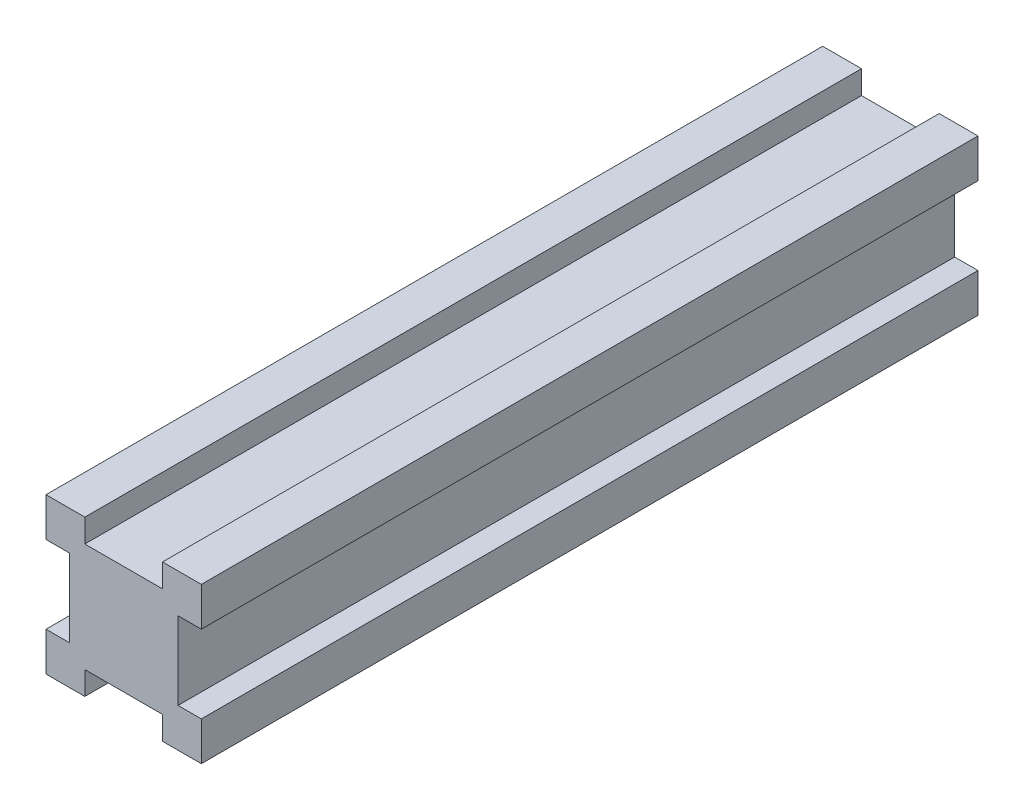
ISO-10303-21;
HEADER;
FILE_DESCRIPTION(('STEP AP214'),'2;1');
FILE_NAME('part.step','',(''),(''),'','','');
FILE_SCHEMA(('AUTOMOTIVE_DESIGN { 1 0 10303 214 1 1 1 1 }'));
ENDSEC;
DATA;
#1=APPLICATION_CONTEXT('core data for automotive mechanical design processes');
#2=APPLICATION_PROTOCOL_DEFINITION('international standard','automotive_design',2000,#1);
#3=PRODUCT_CONTEXT('',#1,'mechanical');
#4=PRODUCT('Part','Part','',(#3));
#5=PRODUCT_RELATED_PRODUCT_CATEGORY('part','',(#4));
#6=PRODUCT_DEFINITION_FORMATION('','',#4);
#7=PRODUCT_DEFINITION_CONTEXT('part definition',#1,'design');
#8=PRODUCT_DEFINITION('design','',#6,#7);
#9=PRODUCT_DEFINITION_SHAPE('','',#8);
#10=(LENGTH_UNIT() NAMED_UNIT(*) SI_UNIT(.MILLI.,.METRE.));
#11=(NAMED_UNIT(*) PLANE_ANGLE_UNIT() SI_UNIT($,.RADIAN.));
#12=(NAMED_UNIT(*) SI_UNIT($,.STERADIAN.) SOLID_ANGLE_UNIT());
#13=UNCERTAINTY_MEASURE_WITH_UNIT(LENGTH_MEASURE(1.E-05),#10,'distance_accuracy_value','');
#14=(GEOMETRIC_REPRESENTATION_CONTEXT(3) GLOBAL_UNCERTAINTY_ASSIGNED_CONTEXT((#13)) GLOBAL_UNIT_ASSIGNED_CONTEXT((#10,
#11,#12)) REPRESENTATION_CONTEXT('',''));
#15=CARTESIAN_POINT('',(0.,0.,0.));
#16=DIRECTION('',(0.,0.,1.));
#17=DIRECTION('',(1.,0.,0.));
#18=AXIS2_PLACEMENT_3D('',#15,#16,#17);
#19=CARTESIAN_POINT('',(-10.,0.,50.));
#20=DIRECTION('',(-1.,0.,0.));
#21=DIRECTION('',(0.,-1.,0.));
#22=AXIS2_PLACEMENT_3D('',#19,#20,#21);
#23=PLANE('',#22);
#24=DIRECTION('',(0.,1.,0.));
#25=VECTOR('',#24,1.);
#26=CARTESIAN_POINT('',(-10.,0.,-50.));
#27=LINE('',#26,#25);
#28=CARTESIAN_POINT('',(-10.,5.,-50.));
#29=VERTEX_POINT('',#28);
#30=CARTESIAN_POINT('',(-10.,10.,-50.));
#31=VERTEX_POINT('',#30);
#32=EDGE_CURVE('E204',#29,#31,#27,.T.);
#33=ORIENTED_EDGE('',*,*,#32,.F.);
#34=DIRECTION('',(0.,0.,-1.));
#35=VECTOR('',#34,1.);
#36=CARTESIAN_POINT('',(-10.,5.,50.));
#37=LINE('',#36,#35);
#38=CARTESIAN_POINT('',(-10.,5.,50.));
#39=VERTEX_POINT('',#38);
#40=EDGE_CURVE('E11',#39,#29,#37,.T.);
#41=ORIENTED_EDGE('',*,*,#40,.F.);
#42=DIRECTION('',(0.,1.,0.));
#43=VECTOR('',#42,1.);
#44=CARTESIAN_POINT('',(-10.,0.,50.));
#45=LINE('',#44,#43);
#46=CARTESIAN_POINT('',(-10.,10.,50.));
#47=VERTEX_POINT('',#46);
#48=EDGE_CURVE('E258',#39,#47,#45,.T.);
#49=ORIENTED_EDGE('',*,*,#48,.T.);
#50=DIRECTION('',(0.,0.,-1.));
#51=VECTOR('',#50,1.);
#52=CARTESIAN_POINT('',(-10.,10.,50.));
#53=LINE('',#52,#51);
#54=EDGE_CURVE('E55',#47,#31,#53,.T.);
#55=ORIENTED_EDGE('',*,*,#54,.T.);
#56=EDGE_LOOP('',(#33,#41,#49,#55));
#57=FACE_BOUND('',#56,.T.);
#58=ADVANCED_FACE('F39',(#57),#23,.T.);
#59=CARTESIAN_POINT('',(0.,5.,50.));
#60=DIRECTION('',(0.,-1.,0.));
#61=DIRECTION('',(1.,0.,0.));
#62=AXIS2_PLACEMENT_3D('',#59,#60,#61);
#63=PLANE('',#62);
#64=DIRECTION('',(-1.,0.,0.));
#65=VECTOR('',#64,1.);
#66=CARTESIAN_POINT('',(0.,5.,-50.));
#67=LINE('',#66,#65);
#68=CARTESIAN_POINT('',(-7.,5.,-50.));
#69=VERTEX_POINT('',#68);
#70=EDGE_CURVE('E206',#69,#29,#67,.T.);
#71=ORIENTED_EDGE('',*,*,#70,.F.);
#72=DIRECTION('',(0.,0.,-1.));
#73=VECTOR('',#72,1.);
#74=CARTESIAN_POINT('',(-7.,5.,50.));
#75=LINE('',#74,#73);
#76=CARTESIAN_POINT('',(-7.,5.,50.));
#77=VERTEX_POINT('',#76);
#78=EDGE_CURVE('E47',#77,#69,#75,.T.);
#79=ORIENTED_EDGE('',*,*,#78,.F.);
#80=DIRECTION('',(-1.,0.,0.));
#81=VECTOR('',#80,1.);
#82=CARTESIAN_POINT('',(0.,5.,50.));
#83=LINE('',#82,#81);
#84=EDGE_CURVE('E313',#77,#39,#83,.T.);
#85=ORIENTED_EDGE('',*,*,#84,.T.);
#86=ORIENTED_EDGE('',*,*,#40,.T.);
#87=EDGE_LOOP('',(#71,#79,#85,#86));
#88=FACE_BOUND('',#87,.T.);
#89=ADVANCED_FACE('F300',(#88),#63,.T.);
#90=CARTESIAN_POINT('',(-7.,0.,50.));
#91=DIRECTION('',(-1.,0.,0.));
#92=DIRECTION('',(0.,-1.,0.));
#93=AXIS2_PLACEMENT_3D('',#90,#91,#92);
#94=PLANE('',#93);
#95=DIRECTION('',(0.,1.,0.));
#96=VECTOR('',#95,1.);
#97=CARTESIAN_POINT('',(-7.,0.,-50.));
#98=LINE('',#97,#96);
#99=CARTESIAN_POINT('',(-7.,-5.,-50.));
#100=VERTEX_POINT('',#99);
#101=EDGE_CURVE('E209',#100,#69,#98,.T.);
#102=ORIENTED_EDGE('',*,*,#101,.F.);
#103=DIRECTION('',(0.,0.,-1.));
#104=VECTOR('',#103,1.);
#105=CARTESIAN_POINT('',(-7.,-5.,50.));
#106=LINE('',#105,#104);
#107=CARTESIAN_POINT('',(-7.,-5.,50.));
#108=VERTEX_POINT('',#107);
#109=EDGE_CURVE('E289',#108,#100,#106,.T.);
#110=ORIENTED_EDGE('',*,*,#109,.F.);
#111=DIRECTION('',(0.,1.,0.));
#112=VECTOR('',#111,1.);
#113=CARTESIAN_POINT('',(-7.,0.,50.));
#114=LINE('',#113,#112);
#115=EDGE_CURVE('E296',#108,#77,#114,.T.);
#116=ORIENTED_EDGE('',*,*,#115,.T.);
#117=ORIENTED_EDGE('',*,*,#78,.T.);
#118=EDGE_LOOP('',(#102,#110,#116,#117));
#119=FACE_BOUND('',#118,.T.);
#120=ADVANCED_FACE('F294',(#119),#94,.T.);
#121=CARTESIAN_POINT('',(0.,-5.,50.));
#122=DIRECTION('',(0.,1.,0.));
#123=DIRECTION('',(-1.,0.,0.));
#124=AXIS2_PLACEMENT_3D('',#121,#122,#123);
#125=PLANE('',#124);
#126=DIRECTION('',(1.,0.,0.));
#127=VECTOR('',#126,1.);
#128=CARTESIAN_POINT('',(0.,-5.,-50.));
#129=LINE('',#128,#127);
#130=CARTESIAN_POINT('',(-10.,-5.,-50.));
#131=VERTEX_POINT('',#130);
#132=EDGE_CURVE('E212',#131,#100,#129,.T.);
#133=ORIENTED_EDGE('',*,*,#132,.F.);
#134=DIRECTION('',(0.,0.,-1.));
#135=VECTOR('',#134,1.);
#136=CARTESIAN_POINT('',(-10.,-5.,50.));
#137=LINE('',#136,#135);
#138=CARTESIAN_POINT('',(-10.,-5.,50.));
#139=VERTEX_POINT('',#138);
#140=EDGE_CURVE('E287',#139,#131,#137,.T.);
#141=ORIENTED_EDGE('',*,*,#140,.F.);
#142=DIRECTION('',(1.,0.,0.));
#143=VECTOR('',#142,1.);
#144=CARTESIAN_POINT('',(0.,-5.,50.));
#145=LINE('',#144,#143);
#146=EDGE_CURVE('E310',#139,#108,#145,.T.);
#147=ORIENTED_EDGE('',*,*,#146,.T.);
#148=ORIENTED_EDGE('',*,*,#109,.T.);
#149=EDGE_LOOP('',(#133,#141,#147,#148));
#150=FACE_BOUND('',#149,.T.);
#151=ADVANCED_FACE('F307',(#150),#125,.T.);
#152=CARTESIAN_POINT('',(-9.99999999999999,0.,50.));
#153=DIRECTION('',(-1.,0.,0.));
#154=DIRECTION('',(0.,-1.,0.));
#155=AXIS2_PLACEMENT_3D('',#152,#153,#154);
#156=PLANE('',#155);
#157=DIRECTION('',(0.,1.,0.));
#158=VECTOR('',#157,1.);
#159=CARTESIAN_POINT('',(-9.99999999999999,0.,-50.));
#160=LINE('',#159,#158);
#161=CARTESIAN_POINT('',(-10.,-10.,-50.));
#162=VERTEX_POINT('',#161);
#163=EDGE_CURVE('E215',#162,#131,#160,.T.);
#164=ORIENTED_EDGE('',*,*,#163,.F.);
#165=DIRECTION('',(0.,0.,-1.));
#166=VECTOR('',#165,1.);
#167=CARTESIAN_POINT('',(-10.,-10.,50.));
#168=LINE('',#167,#166);
#169=CARTESIAN_POINT('',(-10.,-10.,50.));
#170=VERTEX_POINT('',#169);
#171=EDGE_CURVE('E285',#170,#162,#168,.T.);
#172=ORIENTED_EDGE('',*,*,#171,.F.);
#173=DIRECTION('',(0.,1.,0.));
#174=VECTOR('',#173,1.);
#175=CARTESIAN_POINT('',(-9.99999999999999,0.,50.));
#176=LINE('',#175,#174);
#177=EDGE_CURVE('E315',#170,#139,#176,.T.);
#178=ORIENTED_EDGE('',*,*,#177,.T.);
#179=ORIENTED_EDGE('',*,*,#140,.T.);
#180=EDGE_LOOP('',(#164,#172,#178,#179));
#181=FACE_BOUND('',#180,.T.);
#182=ADVANCED_FACE('F373',(#181),#156,.T.);
#183=CARTESIAN_POINT('',(0.,-10.,50.));
#184=DIRECTION('',(0.,1.,0.));
#185=DIRECTION('',(0.,0.,1.));
#186=AXIS2_PLACEMENT_3D('',#183,#184,#185);
#187=PLANE('',#186);
#188=DIRECTION('',(1.,0.,0.));
#189=VECTOR('',#188,1.);
#190=CARTESIAN_POINT('',(0.,-10.,-50.));
#191=LINE('',#190,#189);
#192=CARTESIAN_POINT('',(-5.,-10.,-50.));
#193=VERTEX_POINT('',#192);
#194=EDGE_CURVE('E218',#162,#193,#191,.T.);
#195=ORIENTED_EDGE('',*,*,#194,.T.);
#196=DIRECTION('',(0.,0.,-1.));
#197=VECTOR('',#196,1.);
#198=CARTESIAN_POINT('',(-5.,-10.,50.));
#199=LINE('',#198,#197);
#200=CARTESIAN_POINT('',(-5.,-10.,50.));
#201=VERTEX_POINT('',#200);
#202=EDGE_CURVE('E283',#201,#193,#199,.T.);
#203=ORIENTED_EDGE('',*,*,#202,.F.);
#204=DIRECTION('',(1.,0.,0.));
#205=VECTOR('',#204,1.);
#206=CARTESIAN_POINT('',(0.,-10.,50.));
#207=LINE('',#206,#205);
#208=EDGE_CURVE('E321',#170,#201,#207,.T.);
#209=ORIENTED_EDGE('',*,*,#208,.F.);
#210=ORIENTED_EDGE('',*,*,#171,.T.);
#211=EDGE_LOOP('',(#195,#203,#209,#210));
#212=FACE_BOUND('',#211,.T.);
#213=ADVANCED_FACE('F376',(#212),#187,.F.);
#214=CARTESIAN_POINT('',(-5.,0.,50.));
#215=DIRECTION('',(1.,0.,0.));
#216=DIRECTION('',(0.,0.,-1.));
#217=AXIS2_PLACEMENT_3D('',#214,#215,#216);
#218=PLANE('',#217);
#219=DIRECTION('',(0.,-1.,0.));
#220=VECTOR('',#219,1.);
#221=CARTESIAN_POINT('',(-5.,0.,-50.));
#222=LINE('',#221,#220);
#223=CARTESIAN_POINT('',(-5.,-7.,-50.));
#224=VERTEX_POINT('',#223);
#225=EDGE_CURVE('E221',#224,#193,#222,.T.);
#226=ORIENTED_EDGE('',*,*,#225,.F.);
#227=DIRECTION('',(0.,0.,-1.));
#228=VECTOR('',#227,1.);
#229=CARTESIAN_POINT('',(-5.,-7.,50.));
#230=LINE('',#229,#228);
#231=CARTESIAN_POINT('',(-5.,-7.,50.));
#232=VERTEX_POINT('',#231);
#233=EDGE_CURVE('E281',#232,#224,#230,.T.);
#234=ORIENTED_EDGE('',*,*,#233,.F.);
#235=DIRECTION('',(0.,-1.,0.));
#236=VECTOR('',#235,1.);
#237=CARTESIAN_POINT('',(-5.,0.,50.));
#238=LINE('',#237,#236);
#239=EDGE_CURVE('E323',#232,#201,#238,.T.);
#240=ORIENTED_EDGE('',*,*,#239,.T.);
#241=ORIENTED_EDGE('',*,*,#202,.T.);
#242=EDGE_LOOP('',(#226,#234,#240,#241));
#243=FACE_BOUND('',#242,.T.);
#244=ADVANCED_FACE('F378',(#243),#218,.T.);
#245=CARTESIAN_POINT('',(0.,-7.,50.));
#246=DIRECTION('',(0.,-1.,0.));
#247=DIRECTION('',(1.,0.,0.));
#248=AXIS2_PLACEMENT_3D('',#245,#246,#247);
#249=PLANE('',#248);
#250=DIRECTION('',(-1.,0.,0.));
#251=VECTOR('',#250,1.);
#252=CARTESIAN_POINT('',(0.,-7.,-50.));
#253=LINE('',#252,#251);
#254=CARTESIAN_POINT('',(5.,-7.,-50.));
#255=VERTEX_POINT('',#254);
#256=EDGE_CURVE('E225',#255,#224,#253,.T.);
#257=ORIENTED_EDGE('',*,*,#256,.F.);
#258=DIRECTION('',(0.,0.,-1.));
#259=VECTOR('',#258,1.);
#260=CARTESIAN_POINT('',(5.,-7.,50.));
#261=LINE('',#260,#259);
#262=CARTESIAN_POINT('',(5.,-7.,50.));
#263=VERTEX_POINT('',#262);
#264=EDGE_CURVE('E279',#263,#255,#261,.T.);
#265=ORIENTED_EDGE('',*,*,#264,.F.);
#266=DIRECTION('',(-1.,0.,0.));
#267=VECTOR('',#266,1.);
#268=CARTESIAN_POINT('',(0.,-7.,50.));
#269=LINE('',#268,#267);
#270=EDGE_CURVE('E327',#263,#232,#269,.T.);
#271=ORIENTED_EDGE('',*,*,#270,.T.);
#272=ORIENTED_EDGE('',*,*,#233,.T.);
#273=EDGE_LOOP('',(#257,#265,#271,#272));
#274=FACE_BOUND('',#273,.T.);
#275=ADVANCED_FACE('F381',(#274),#249,.T.);
#276=CARTESIAN_POINT('',(5.,0.,50.));
#277=DIRECTION('',(-1.,0.,0.));
#278=DIRECTION('',(0.,0.,1.));
#279=AXIS2_PLACEMENT_3D('',#276,#277,#278);
#280=PLANE('',#279);
#281=DIRECTION('',(0.,1.,0.));
#282=VECTOR('',#281,1.);
#283=CARTESIAN_POINT('',(5.,0.,-50.));
#284=LINE('',#283,#282);
#285=CARTESIAN_POINT('',(5.,-10.,-50.));
#286=VERTEX_POINT('',#285);
#287=EDGE_CURVE('E228',#286,#255,#284,.T.);
#288=ORIENTED_EDGE('',*,*,#287,.F.);
#289=DIRECTION('',(0.,0.,-1.));
#290=VECTOR('',#289,1.);
#291=CARTESIAN_POINT('',(5.,-10.,50.));
#292=LINE('',#291,#290);
#293=CARTESIAN_POINT('',(5.,-10.,50.));
#294=VERTEX_POINT('',#293);
#295=EDGE_CURVE('E277',#294,#286,#292,.T.);
#296=ORIENTED_EDGE('',*,*,#295,.F.);
#297=DIRECTION('',(0.,1.,0.));
#298=VECTOR('',#297,1.);
#299=CARTESIAN_POINT('',(5.,0.,50.));
#300=LINE('',#299,#298);
#301=EDGE_CURVE('E330',#294,#263,#300,.T.);
#302=ORIENTED_EDGE('',*,*,#301,.T.);
#303=ORIENTED_EDGE('',*,*,#264,.T.);
#304=EDGE_LOOP('',(#288,#296,#302,#303));
#305=FACE_BOUND('',#304,.T.);
#306=ADVANCED_FACE('F385',(#305),#280,.T.);
#307=CARTESIAN_POINT('',(10.,-10.,-50.));
#308=VERTEX_POINT('',#307);
#309=EDGE_CURVE('E222',#286,#308,#191,.T.);
#310=ORIENTED_EDGE('',*,*,#309,.T.);
#311=DIRECTION('',(0.,0.,-1.));
#312=VECTOR('',#311,1.);
#313=CARTESIAN_POINT('',(10.,-10.,50.));
#314=LINE('',#313,#312);
#315=CARTESIAN_POINT('',(10.,-10.,50.));
#316=VERTEX_POINT('',#315);
#317=EDGE_CURVE('E274',#316,#308,#314,.T.);
#318=ORIENTED_EDGE('',*,*,#317,.F.);
#319=EDGE_CURVE('E324',#294,#316,#207,.T.);
#320=ORIENTED_EDGE('',*,*,#319,.F.);
#321=ORIENTED_EDGE('',*,*,#295,.T.);
#322=EDGE_LOOP('',(#310,#318,#320,#321));
#323=FACE_BOUND('',#322,.T.);
#324=ADVANCED_FACE('F389',(#323),#187,.F.);
#325=CARTESIAN_POINT('',(10.,0.,50.));
#326=DIRECTION('',(-1.,0.,0.));
#327=DIRECTION('',(0.,0.,1.));
#328=AXIS2_PLACEMENT_3D('',#325,#326,#327);
#329=PLANE('',#328);
#330=DIRECTION('',(0.,1.,0.));
#331=VECTOR('',#330,1.);
#332=CARTESIAN_POINT('',(10.,0.,-50.));
#333=LINE('',#332,#331);
#334=CARTESIAN_POINT('',(10.,-5.,-50.));
#335=VERTEX_POINT('',#334);
#336=EDGE_CURVE('E231',#308,#335,#333,.T.);
#337=ORIENTED_EDGE('',*,*,#336,.T.);
#338=DIRECTION('',(0.,0.,-1.));
#339=VECTOR('',#338,1.);
#340=CARTESIAN_POINT('',(10.,-5.,50.));
#341=LINE('',#340,#339);
#342=CARTESIAN_POINT('',(10.,-5.,50.));
#343=VERTEX_POINT('',#342);
#344=EDGE_CURVE('E272',#343,#335,#341,.T.);
#345=ORIENTED_EDGE('',*,*,#344,.F.);
#346=DIRECTION('',(0.,1.,0.));
#347=VECTOR('',#346,1.);
#348=CARTESIAN_POINT('',(10.,0.,50.));
#349=LINE('',#348,#347);
#350=EDGE_CURVE('E333',#316,#343,#349,.T.);
#351=ORIENTED_EDGE('',*,*,#350,.F.);
#352=ORIENTED_EDGE('',*,*,#317,.T.);
#353=EDGE_LOOP('',(#337,#345,#351,#352));
#354=FACE_BOUND('',#353,.T.);
#355=ADVANCED_FACE('F393',(#354),#329,.F.);
#356=CARTESIAN_POINT('',(0.,-5.,50.));
#357=DIRECTION('',(0.,1.,0.));
#358=DIRECTION('',(-1.,0.,0.));
#359=AXIS2_PLACEMENT_3D('',#356,#357,#358);
#360=PLANE('',#359);
#361=DIRECTION('',(1.,0.,0.));
#362=VECTOR('',#361,1.);
#363=CARTESIAN_POINT('',(0.,-5.,-50.));
#364=LINE('',#363,#362);
#365=CARTESIAN_POINT('',(7.,-5.,-50.));
#366=VERTEX_POINT('',#365);
#367=EDGE_CURVE('E234',#366,#335,#364,.T.);
#368=ORIENTED_EDGE('',*,*,#367,.F.);
#369=DIRECTION('',(0.,0.,-1.));
#370=VECTOR('',#369,1.);
#371=CARTESIAN_POINT('',(7.,-5.,50.));
#372=LINE('',#371,#370);
#373=CARTESIAN_POINT('',(7.,-5.,50.));
#374=VERTEX_POINT('',#373);
#375=EDGE_CURVE('E270',#374,#366,#372,.T.);
#376=ORIENTED_EDGE('',*,*,#375,.F.);
#377=DIRECTION('',(1.,0.,0.));
#378=VECTOR('',#377,1.);
#379=CARTESIAN_POINT('',(0.,-5.,50.));
#380=LINE('',#379,#378);
#381=EDGE_CURVE('E335',#374,#343,#380,.T.);
#382=ORIENTED_EDGE('',*,*,#381,.T.);
#383=ORIENTED_EDGE('',*,*,#344,.T.);
#384=EDGE_LOOP('',(#368,#376,#382,#383));
#385=FACE_BOUND('',#384,.T.);
#386=ADVANCED_FACE('F397',(#385),#360,.T.);
#387=CARTESIAN_POINT('',(7.,0.,50.));
#388=DIRECTION('',(1.,0.,0.));
#389=DIRECTION('',(0.,0.,-1.));
#390=AXIS2_PLACEMENT_3D('',#387,#388,#389);
#391=PLANE('',#390);
#392=DIRECTION('',(0.,-1.,0.));
#393=VECTOR('',#392,1.);
#394=CARTESIAN_POINT('',(7.,0.,-50.));
#395=LINE('',#394,#393);
#396=CARTESIAN_POINT('',(7.,5.,-50.));
#397=VERTEX_POINT('',#396);
#398=EDGE_CURVE('E237',#397,#366,#395,.T.);
#399=ORIENTED_EDGE('',*,*,#398,.F.);
#400=DIRECTION('',(0.,0.,-1.));
#401=VECTOR('',#400,1.);
#402=CARTESIAN_POINT('',(7.,5.,50.));
#403=LINE('',#402,#401);
#404=CARTESIAN_POINT('',(7.,5.,50.));
#405=VERTEX_POINT('',#404);
#406=EDGE_CURVE('E268',#405,#397,#403,.T.);
#407=ORIENTED_EDGE('',*,*,#406,.F.);
#408=DIRECTION('',(0.,-1.,0.));
#409=VECTOR('',#408,1.);
#410=CARTESIAN_POINT('',(7.,0.,50.));
#411=LINE('',#410,#409);
#412=EDGE_CURVE('E338',#405,#374,#411,.T.);
#413=ORIENTED_EDGE('',*,*,#412,.T.);
#414=ORIENTED_EDGE('',*,*,#375,.T.);
#415=EDGE_LOOP('',(#399,#407,#413,#414));
#416=FACE_BOUND('',#415,.T.);
#417=ADVANCED_FACE('F401',(#416),#391,.T.);
#418=CARTESIAN_POINT('',(0.,5.,50.));
#419=DIRECTION('',(0.,-1.,0.));
#420=DIRECTION('',(1.,0.,0.));
#421=AXIS2_PLACEMENT_3D('',#418,#419,#420);
#422=PLANE('',#421);
#423=DIRECTION('',(-1.,0.,0.));
#424=VECTOR('',#423,1.);
#425=CARTESIAN_POINT('',(0.,5.,-50.));
#426=LINE('',#425,#424);
#427=CARTESIAN_POINT('',(10.,5.,-50.));
#428=VERTEX_POINT('',#427);
#429=EDGE_CURVE('E240',#428,#397,#426,.T.);
#430=ORIENTED_EDGE('',*,*,#429,.F.);
#431=DIRECTION('',(0.,0.,-1.));
#432=VECTOR('',#431,1.);
#433=CARTESIAN_POINT('',(10.,5.,50.));
#434=LINE('',#433,#432);
#435=CARTESIAN_POINT('',(10.,5.,50.));
#436=VERTEX_POINT('',#435);
#437=EDGE_CURVE('E266',#436,#428,#434,.T.);
#438=ORIENTED_EDGE('',*,*,#437,.F.);
#439=DIRECTION('',(-1.,0.,0.));
#440=VECTOR('',#439,1.);
#441=CARTESIAN_POINT('',(0.,5.,50.));
#442=LINE('',#441,#440);
#443=EDGE_CURVE('E341',#436,#405,#442,.T.);
#444=ORIENTED_EDGE('',*,*,#443,.T.);
#445=ORIENTED_EDGE('',*,*,#406,.T.);
#446=EDGE_LOOP('',(#430,#438,#444,#445));
#447=FACE_BOUND('',#446,.T.);
#448=ADVANCED_FACE('F405',(#447),#422,.T.);
#449=CARTESIAN_POINT('',(10.,0.,50.));
#450=DIRECTION('',(-1.,0.,0.));
#451=DIRECTION('',(0.,0.,1.));
#452=AXIS2_PLACEMENT_3D('',#449,#450,#451);
#453=PLANE('',#452);
#454=DIRECTION('',(0.,1.,0.));
#455=VECTOR('',#454,1.);
#456=CARTESIAN_POINT('',(10.,0.,-50.));
#457=LINE('',#456,#455);
#458=CARTESIAN_POINT('',(10.,10.,-50.));
#459=VERTEX_POINT('',#458);
#460=EDGE_CURVE('E243',#428,#459,#457,.T.);
#461=ORIENTED_EDGE('',*,*,#460,.T.);
#462=DIRECTION('',(0.,0.,-1.));
#463=VECTOR('',#462,1.);
#464=CARTESIAN_POINT('',(10.,10.,50.));
#465=LINE('',#464,#463);
#466=CARTESIAN_POINT('',(10.,10.,50.));
#467=VERTEX_POINT('',#466);
#468=EDGE_CURVE('E264',#467,#459,#465,.T.);
#469=ORIENTED_EDGE('',*,*,#468,.F.);
#470=DIRECTION('',(0.,1.,0.));
#471=VECTOR('',#470,1.);
#472=CARTESIAN_POINT('',(10.,0.,50.));
#473=LINE('',#472,#471);
#474=EDGE_CURVE('E344',#436,#467,#473,.T.);
#475=ORIENTED_EDGE('',*,*,#474,.F.);
#476=ORIENTED_EDGE('',*,*,#437,.T.);
#477=EDGE_LOOP('',(#461,#469,#475,#476));
#478=FACE_BOUND('',#477,.T.);
#479=ADVANCED_FACE('F409',(#478),#453,.F.);
#480=CARTESIAN_POINT('',(0.,10.,50.));
#481=DIRECTION('',(0.,1.,0.));
#482=DIRECTION('',(0.,0.,1.));
#483=AXIS2_PLACEMENT_3D('',#480,#481,#482);
#484=PLANE('',#483);
#485=DIRECTION('',(1.,0.,0.));
#486=VECTOR('',#485,1.);
#487=CARTESIAN_POINT('',(0.,10.,-50.));
#488=LINE('',#487,#486);
#489=CARTESIAN_POINT('',(5.,10.,-50.));
#490=VERTEX_POINT('',#489);
#491=EDGE_CURVE('E246',#490,#459,#488,.T.);
#492=ORIENTED_EDGE('',*,*,#491,.F.);
#493=DIRECTION('',(0.,0.,-1.));
#494=VECTOR('',#493,1.);
#495=CARTESIAN_POINT('',(5.,10.,50.));
#496=LINE('',#495,#494);
#497=CARTESIAN_POINT('',(5.,10.,50.));
#498=VERTEX_POINT('',#497);
#499=EDGE_CURVE('E262',#498,#490,#496,.T.);
#500=ORIENTED_EDGE('',*,*,#499,.F.);
#501=DIRECTION('',(1.,0.,0.));
#502=VECTOR('',#501,1.);
#503=CARTESIAN_POINT('',(0.,10.,50.));
#504=LINE('',#503,#502);
#505=EDGE_CURVE('E346',#498,#467,#504,.T.);
#506=ORIENTED_EDGE('',*,*,#505,.T.);
#507=ORIENTED_EDGE('',*,*,#468,.T.);
#508=EDGE_LOOP('',(#492,#500,#506,#507));
#509=FACE_BOUND('',#508,.T.);
#510=ADVANCED_FACE('F413',(#509),#484,.T.);
#511=CARTESIAN_POINT('',(5.,0.,50.));
#512=DIRECTION('',(-1.,0.,0.));
#513=DIRECTION('',(0.,-1.,0.));
#514=AXIS2_PLACEMENT_3D('',#511,#512,#513);
#515=PLANE('',#514);
#516=DIRECTION('',(0.,1.,0.));
#517=VECTOR('',#516,1.);
#518=CARTESIAN_POINT('',(5.,0.,-50.));
#519=LINE('',#518,#517);
#520=CARTESIAN_POINT('',(5.,7.,-50.));
#521=VERTEX_POINT('',#520);
#522=EDGE_CURVE('E249',#521,#490,#519,.T.);
#523=ORIENTED_EDGE('',*,*,#522,.F.);
#524=DIRECTION('',(0.,0.,-1.));
#525=VECTOR('',#524,1.);
#526=CARTESIAN_POINT('',(5.,7.,50.));
#527=LINE('',#526,#525);
#528=CARTESIAN_POINT('',(5.,7.,50.));
#529=VERTEX_POINT('',#528);
#530=EDGE_CURVE('E186',#529,#521,#527,.T.);
#531=ORIENTED_EDGE('',*,*,#530,.F.);
#532=DIRECTION('',(0.,1.,0.));
#533=VECTOR('',#532,1.);
#534=CARTESIAN_POINT('',(5.,0.,50.));
#535=LINE('',#534,#533);
#536=EDGE_CURVE('E196',#529,#498,#535,.T.);
#537=ORIENTED_EDGE('',*,*,#536,.T.);
#538=ORIENTED_EDGE('',*,*,#499,.T.);
#539=EDGE_LOOP('',(#523,#531,#537,#538));
#540=FACE_BOUND('',#539,.T.);
#541=ADVANCED_FACE('F350',(#540),#515,.T.);
#542=CARTESIAN_POINT('',(0.,7.,50.));
#543=DIRECTION('',(0.,1.,0.));
#544=DIRECTION('',(0.,0.,1.));
#545=AXIS2_PLACEMENT_3D('',#542,#543,#544);
#546=PLANE('',#545);
#547=DIRECTION('',(1.,0.,0.));
#548=VECTOR('',#547,1.);
#549=CARTESIAN_POINT('',(0.,7.,-50.));
#550=LINE('',#549,#548);
#551=CARTESIAN_POINT('',(-5.,7.,-50.));
#552=VERTEX_POINT('',#551);
#553=EDGE_CURVE('E182',#552,#521,#550,.T.);
#554=ORIENTED_EDGE('',*,*,#553,.F.);
#555=DIRECTION('',(0.,0.,-1.));
#556=VECTOR('',#555,1.);
#557=CARTESIAN_POINT('',(-5.,7.,50.));
#558=LINE('',#557,#556);
#559=CARTESIAN_POINT('',(-5.,7.,50.));
#560=VERTEX_POINT('',#559);
#561=EDGE_CURVE('E177',#560,#552,#558,.T.);
#562=ORIENTED_EDGE('',*,*,#561,.F.);
#563=DIRECTION('',(1.,0.,0.));
#564=VECTOR('',#563,1.);
#565=CARTESIAN_POINT('',(0.,7.,50.));
#566=LINE('',#565,#564);
#567=EDGE_CURVE('E180',#560,#529,#566,.T.);
#568=ORIENTED_EDGE('',*,*,#567,.T.);
#569=ORIENTED_EDGE('',*,*,#530,.T.);
#570=EDGE_LOOP('',(#554,#562,#568,#569));
#571=FACE_BOUND('',#570,.T.);
#572=ADVANCED_FACE('F179',(#571),#546,.T.);
#573=CARTESIAN_POINT('',(-5.,0.,50.));
#574=DIRECTION('',(1.,0.,0.));
#575=DIRECTION('',(0.,1.,0.));
#576=AXIS2_PLACEMENT_3D('',#573,#574,#575);
#577=PLANE('',#576);
#578=DIRECTION('',(0.,-1.,0.));
#579=VECTOR('',#578,1.);
#580=CARTESIAN_POINT('',(-5.,0.,-50.));
#581=LINE('',#580,#579);
#582=CARTESIAN_POINT('',(-5.,10.,-50.));
#583=VERTEX_POINT('',#582);
#584=EDGE_CURVE('E253',#583,#552,#581,.T.);
#585=ORIENTED_EDGE('',*,*,#584,.F.);
#586=DIRECTION('',(0.,0.,-1.));
#587=VECTOR('',#586,1.);
#588=CARTESIAN_POINT('',(-5.,10.,50.));
#589=LINE('',#588,#587);
#590=CARTESIAN_POINT('',(-5.,10.,50.));
#591=VERTEX_POINT('',#590);
#592=EDGE_CURVE('E116',#591,#583,#589,.T.);
#593=ORIENTED_EDGE('',*,*,#592,.F.);
#594=DIRECTION('',(0.,-1.,0.));
#595=VECTOR('',#594,1.);
#596=CARTESIAN_POINT('',(-5.,0.,50.));
#597=LINE('',#596,#595);
#598=EDGE_CURVE('E193',#591,#560,#597,.T.);
#599=ORIENTED_EDGE('',*,*,#598,.T.);
#600=ORIENTED_EDGE('',*,*,#561,.T.);
#601=EDGE_LOOP('',(#585,#593,#599,#600));
#602=FACE_BOUND('',#601,.T.);
#603=ADVANCED_FACE('F198',(#602),#577,.T.);
#604=CARTESIAN_POINT('',(0.,10.,50.));
#605=DIRECTION('',(0.,1.,0.));
#606=DIRECTION('',(0.,0.,1.));
#607=AXIS2_PLACEMENT_3D('',#604,#605,#606);
#608=PLANE('',#607);
#609=DIRECTION('',(1.,0.,0.));
#610=VECTOR('',#609,1.);
#611=CARTESIAN_POINT('',(0.,10.,-50.));
#612=LINE('',#611,#610);
#613=EDGE_CURVE('E255',#31,#583,#612,.T.);
#614=ORIENTED_EDGE('',*,*,#613,.F.);
#615=ORIENTED_EDGE('',*,*,#54,.F.);
#616=DIRECTION('',(1.,0.,0.));
#617=VECTOR('',#616,1.);
#618=CARTESIAN_POINT('',(0.,10.,50.));
#619=LINE('',#618,#617);
#620=EDGE_CURVE('E199',#47,#591,#619,.T.);
#621=ORIENTED_EDGE('',*,*,#620,.T.);
#622=ORIENTED_EDGE('',*,*,#592,.T.);
#623=EDGE_LOOP('',(#614,#615,#621,#622));
#624=FACE_BOUND('',#623,.T.);
#625=ADVANCED_FACE('F352',(#624),#608,.T.);
#626=CARTESIAN_POINT('',(0.,0.,50.));
#627=DIRECTION('',(0.,0.,1.));
#628=DIRECTION('',(1.,0.,0.));
#629=AXIS2_PLACEMENT_3D('',#626,#627,#628);
#630=PLANE('',#629);
#631=ORIENTED_EDGE('',*,*,#48,.F.);
#632=ORIENTED_EDGE('',*,*,#84,.F.);
#633=ORIENTED_EDGE('',*,*,#115,.F.);
#634=ORIENTED_EDGE('',*,*,#146,.F.);
#635=ORIENTED_EDGE('',*,*,#177,.F.);
#636=ORIENTED_EDGE('',*,*,#208,.T.);
#637=ORIENTED_EDGE('',*,*,#239,.F.);
#638=ORIENTED_EDGE('',*,*,#270,.F.);
#639=ORIENTED_EDGE('',*,*,#301,.F.);
#640=ORIENTED_EDGE('',*,*,#319,.T.);
#641=ORIENTED_EDGE('',*,*,#350,.T.);
#642=ORIENTED_EDGE('',*,*,#381,.F.);
#643=ORIENTED_EDGE('',*,*,#412,.F.);
#644=ORIENTED_EDGE('',*,*,#443,.F.);
#645=ORIENTED_EDGE('',*,*,#474,.T.);
#646=ORIENTED_EDGE('',*,*,#505,.F.);
#647=ORIENTED_EDGE('',*,*,#536,.F.);
#648=ORIENTED_EDGE('',*,*,#567,.F.);
#649=ORIENTED_EDGE('',*,*,#598,.F.);
#650=ORIENTED_EDGE('',*,*,#620,.F.);
#651=EDGE_LOOP('',(#631,#632,#633,#634,#635,#636,#637,#638,#639,#640,#641,#642,#643,#644,#645,
#646,#647,#648,#649,#650));
#652=FACE_BOUND('',#651,.T.);
#653=ADVANCED_FACE('F191',(#652),#630,.T.);
#654=CARTESIAN_POINT('',(0.,0.,-50.));
#655=DIRECTION('',(0.,0.,1.));
#656=DIRECTION('',(1.,0.,0.));
#657=AXIS2_PLACEMENT_3D('',#654,#655,#656);
#658=PLANE('',#657);
#659=ORIENTED_EDGE('',*,*,#32,.T.);
#660=ORIENTED_EDGE('',*,*,#613,.T.);
#661=ORIENTED_EDGE('',*,*,#584,.T.);
#662=ORIENTED_EDGE('',*,*,#553,.T.);
#663=ORIENTED_EDGE('',*,*,#522,.T.);
#664=ORIENTED_EDGE('',*,*,#491,.T.);
#665=ORIENTED_EDGE('',*,*,#460,.F.);
#666=ORIENTED_EDGE('',*,*,#429,.T.);
#667=ORIENTED_EDGE('',*,*,#398,.T.);
#668=ORIENTED_EDGE('',*,*,#367,.T.);
#669=ORIENTED_EDGE('',*,*,#336,.F.);
#670=ORIENTED_EDGE('',*,*,#309,.F.);
#671=ORIENTED_EDGE('',*,*,#287,.T.);
#672=ORIENTED_EDGE('',*,*,#256,.T.);
#673=ORIENTED_EDGE('',*,*,#225,.T.);
#674=ORIENTED_EDGE('',*,*,#194,.F.);
#675=ORIENTED_EDGE('',*,*,#163,.T.);
#676=ORIENTED_EDGE('',*,*,#132,.T.);
#677=ORIENTED_EDGE('',*,*,#101,.T.);
#678=ORIENTED_EDGE('',*,*,#70,.T.);
#679=EDGE_LOOP('',(#659,#660,#661,#662,#663,#664,#665,#666,#667,#668,#669,#670,#671,#672,#673,
#674,#675,#676,#677,#678));
#680=FACE_BOUND('',#679,.T.);
#681=ADVANCED_FACE('F302',(#680),#658,.F.);
#682=CLOSED_SHELL('',(#58,#89,#120,#151,#182,#213,#244,#275,#306,#324,#355,#386,#417,#448,#479,
#510,#541,#572,#603,#625,#653,#681));
#683=MANIFOLD_SOLID_BREP('B2',#682);
#684=ADVANCED_BREP_SHAPE_REPRESENTATION('',(#18,#683),#14);
#685=SHAPE_DEFINITION_REPRESENTATION(#9,#684);
ENDSEC;
END-ISO-10303-21;
